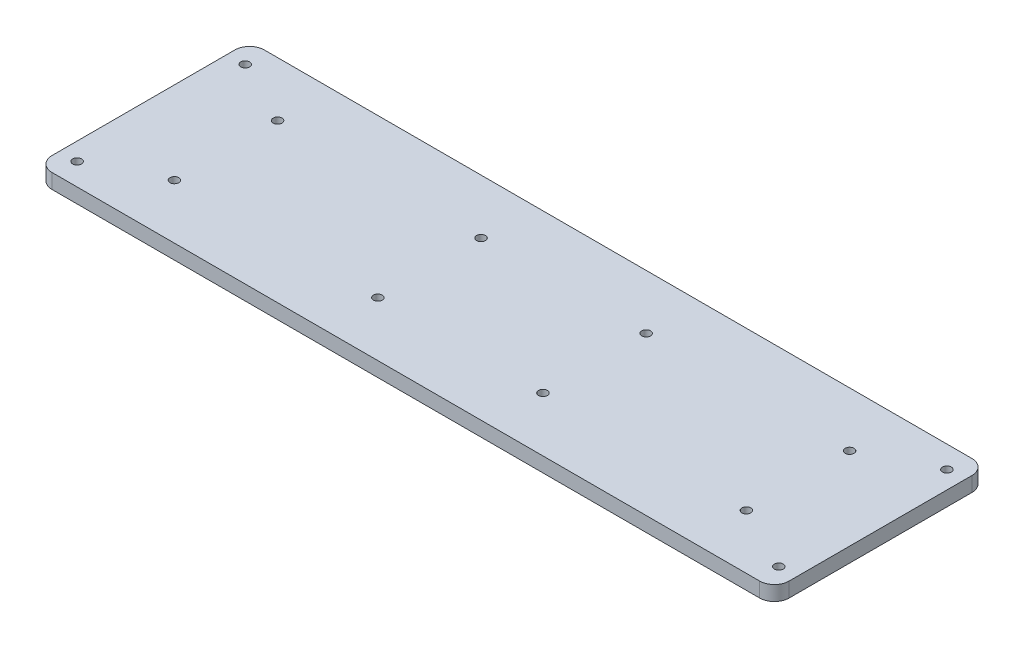
ISO-10303-21;
HEADER;
FILE_DESCRIPTION(('STEP AP214'),'2;1');
FILE_NAME('part.step','',(''),(''),'','','');
FILE_SCHEMA(('AUTOMOTIVE_DESIGN { 1 0 10303 214 1 1 1 1 }'));
ENDSEC;
DATA;
#1=APPLICATION_CONTEXT('core data for automotive mechanical design processes');
#2=APPLICATION_PROTOCOL_DEFINITION('international standard','automotive_design',2000,#1);
#3=PRODUCT_CONTEXT('',#1,'mechanical');
#4=PRODUCT('Part','Part','',(#3));
#5=PRODUCT_RELATED_PRODUCT_CATEGORY('part','',(#4));
#6=PRODUCT_DEFINITION_FORMATION('','',#4);
#7=PRODUCT_DEFINITION_CONTEXT('part definition',#1,'design');
#8=PRODUCT_DEFINITION('design','',#6,#7);
#9=PRODUCT_DEFINITION_SHAPE('','',#8);
#10=(LENGTH_UNIT() NAMED_UNIT(*) SI_UNIT(.MILLI.,.METRE.));
#11=(NAMED_UNIT(*) PLANE_ANGLE_UNIT() SI_UNIT($,.RADIAN.));
#12=(NAMED_UNIT(*) SI_UNIT($,.STERADIAN.) SOLID_ANGLE_UNIT());
#13=UNCERTAINTY_MEASURE_WITH_UNIT(LENGTH_MEASURE(1.E-05),#10,'distance_accuracy_value','');
#14=(GEOMETRIC_REPRESENTATION_CONTEXT(3) GLOBAL_UNCERTAINTY_ASSIGNED_CONTEXT((#13)) GLOBAL_UNIT_ASSIGNED_CONTEXT((#10,
#11,#12)) REPRESENTATION_CONTEXT('',''));
#15=CARTESIAN_POINT('',(0.,0.,0.));
#16=DIRECTION('',(0.,0.,1.));
#17=DIRECTION('',(1.,0.,0.));
#18=AXIS2_PLACEMENT_3D('',#15,#16,#17);
#19=CARTESIAN_POINT('',(0.,5.,0.));
#20=DIRECTION('',(0.,1.,0.));
#21=DIRECTION('',(0.,0.,1.));
#22=AXIS2_PLACEMENT_3D('',#19,#20,#21);
#23=PLANE('',#22);
#24=CARTESIAN_POINT('',(28.,5.,17.5));
#25=DIRECTION('',(0.,1.,0.));
#26=DIRECTION('',(0.,0.,-1.));
#27=AXIS2_PLACEMENT_3D('',#24,#25,#26);
#28=CIRCLE('',#27,1.5);
#29=CARTESIAN_POINT('',(28.,5.,16.));
#30=VERTEX_POINT('',#29);
#31=EDGE_CURVE('E240',#30,#30,#28,.T.);
#32=ORIENTED_EDGE('',*,*,#31,.F.);
#33=EDGE_LOOP('',(#32));
#34=FACE_BOUND('',#33,.T.);
#35=CARTESIAN_POINT('',(97.,5.,-17.5));
#36=DIRECTION('',(0.,1.,0.));
#37=DIRECTION('',(0.,0.,-1.));
#38=AXIS2_PLACEMENT_3D('',#35,#36,#37);
#39=CIRCLE('',#38,1.5);
#40=CARTESIAN_POINT('',(97.,5.,-19.));
#41=VERTEX_POINT('',#40);
#42=EDGE_CURVE('E228',#41,#41,#39,.T.);
#43=ORIENTED_EDGE('',*,*,#42,.F.);
#44=EDGE_LOOP('',(#43));
#45=FACE_BOUND('',#44,.T.);
#46=CARTESIAN_POINT('',(-28.,5.,-17.5));
#47=DIRECTION('',(0.,1.,0.));
#48=DIRECTION('',(0.,0.,-1.));
#49=AXIS2_PLACEMENT_3D('',#46,#47,#48);
#50=CIRCLE('',#49,1.5);
#51=CARTESIAN_POINT('',(-28.,5.,-19.));
#52=VERTEX_POINT('',#51);
#53=EDGE_CURVE('E216',#52,#52,#50,.T.);
#54=ORIENTED_EDGE('',*,*,#53,.F.);
#55=EDGE_LOOP('',(#54));
#56=FACE_BOUND('',#55,.T.);
#57=CARTESIAN_POINT('',(-97.,5.,-17.5));
#58=DIRECTION('',(0.,1.,0.));
#59=DIRECTION('',(0.,0.,1.));
#60=AXIS2_PLACEMENT_3D('',#57,#58,#59);
#61=CIRCLE('',#60,1.5);
#62=CARTESIAN_POINT('',(-97.,5.,-16.));
#63=VERTEX_POINT('',#62);
#64=EDGE_CURVE('E204',#63,#63,#61,.T.);
#65=ORIENTED_EDGE('',*,*,#64,.F.);
#66=EDGE_LOOP('',(#65));
#67=FACE_BOUND('',#66,.T.);
#68=CARTESIAN_POINT('',(119.,5.,-28.5000000000001));
#69=DIRECTION('',(0.,1.,0.));
#70=DIRECTION('',(0.,0.,1.));
#71=AXIS2_PLACEMENT_3D('',#68,#69,#70);
#72=CIRCLE('',#71,1.5);
#73=CARTESIAN_POINT('',(119.,5.,-27.0000000000001));
#74=VERTEX_POINT('',#73);
#75=EDGE_CURVE('E192',#74,#74,#72,.T.);
#76=ORIENTED_EDGE('',*,*,#75,.F.);
#77=EDGE_LOOP('',(#76));
#78=FACE_BOUND('',#77,.T.);
#79=CARTESIAN_POINT('',(-119.,5.,28.5));
#80=DIRECTION('',(0.,1.,0.));
#81=DIRECTION('',(0.,0.,1.));
#82=AXIS2_PLACEMENT_3D('',#79,#80,#81);
#83=CIRCLE('',#82,1.5);
#84=CARTESIAN_POINT('',(-119.,5.,30.));
#85=VERTEX_POINT('',#84);
#86=EDGE_CURVE('E133',#85,#85,#83,.T.);
#87=ORIENTED_EDGE('',*,*,#86,.F.);
#88=EDGE_LOOP('',(#87));
#89=FACE_BOUND('',#88,.T.);
#90=DIRECTION('',(-1.,0.,0.));
#91=VECTOR('',#90,1.);
#92=CARTESIAN_POINT('',(125.,5.,-36.));
#93=LINE('',#92,#91);
#94=CARTESIAN_POINT('',(120.,5.,-36.));
#95=VERTEX_POINT('',#94);
#96=CARTESIAN_POINT('',(-120.,5.,-36.));
#97=VERTEX_POINT('',#96);
#98=EDGE_CURVE('E142',#95,#97,#93,.T.);
#99=ORIENTED_EDGE('',*,*,#98,.T.);
#100=CARTESIAN_POINT('',(-120.,5.,-31.));
#101=DIRECTION('',(0.,1.,0.));
#102=DIRECTION('',(0.,0.,1.));
#103=AXIS2_PLACEMENT_3D('',#100,#101,#102);
#104=CIRCLE('',#103,5.);
#105=CARTESIAN_POINT('',(-125.,5.,-31.));
#106=VERTEX_POINT('',#105);
#107=EDGE_CURVE('E161',#97,#106,#104,.T.);
#108=ORIENTED_EDGE('',*,*,#107,.T.);
#109=DIRECTION('',(0.,0.,1.));
#110=VECTOR('',#109,1.);
#111=CARTESIAN_POINT('',(-125.,5.,36.));
#112=LINE('',#111,#110);
#113=CARTESIAN_POINT('',(-125.,5.,31.));
#114=VERTEX_POINT('',#113);
#115=EDGE_CURVE('E125',#106,#114,#112,.T.);
#116=ORIENTED_EDGE('',*,*,#115,.T.);
#117=CARTESIAN_POINT('',(-120.,5.,31.));
#118=DIRECTION('',(0.,1.,0.));
#119=DIRECTION('',(0.,0.,1.));
#120=AXIS2_PLACEMENT_3D('',#117,#118,#119);
#121=CIRCLE('',#120,5.);
#122=CARTESIAN_POINT('',(-120.,5.,36.));
#123=VERTEX_POINT('',#122);
#124=EDGE_CURVE('E156',#114,#123,#121,.T.);
#125=ORIENTED_EDGE('',*,*,#124,.T.);
#126=DIRECTION('',(1.,0.,0.));
#127=VECTOR('',#126,1.);
#128=CARTESIAN_POINT('',(125.,5.,36.));
#129=LINE('',#128,#127);
#130=CARTESIAN_POINT('',(120.,5.,36.));
#131=VERTEX_POINT('',#130);
#132=EDGE_CURVE('E172',#123,#131,#129,.T.);
#133=ORIENTED_EDGE('',*,*,#132,.T.);
#134=CARTESIAN_POINT('',(120.,5.,31.));
#135=DIRECTION('',(0.,1.,0.));
#136=DIRECTION('',(0.,0.,1.));
#137=AXIS2_PLACEMENT_3D('',#134,#135,#136);
#138=CIRCLE('',#137,5.);
#139=CARTESIAN_POINT('',(125.,5.,31.));
#140=VERTEX_POINT('',#139);
#141=EDGE_CURVE('E61',#131,#140,#138,.T.);
#142=ORIENTED_EDGE('',*,*,#141,.T.);
#143=DIRECTION('',(0.,0.,-1.));
#144=VECTOR('',#143,1.);
#145=CARTESIAN_POINT('',(125.,5.,36.));
#146=LINE('',#145,#144);
#147=CARTESIAN_POINT('',(125.,5.,-31.));
#148=VERTEX_POINT('',#147);
#149=EDGE_CURVE('E180',#140,#148,#146,.T.);
#150=ORIENTED_EDGE('',*,*,#149,.T.);
#151=CARTESIAN_POINT('',(120.,5.,-31.));
#152=DIRECTION('',(0.,1.,0.));
#153=DIRECTION('',(0.,0.,1.));
#154=AXIS2_PLACEMENT_3D('',#151,#152,#153);
#155=CIRCLE('',#154,5.);
#156=EDGE_CURVE('E159',#148,#95,#155,.T.);
#157=ORIENTED_EDGE('',*,*,#156,.T.);
#158=EDGE_LOOP('',(#99,#108,#116,#125,#133,#142,#150,#157));
#159=FACE_BOUND('',#158,.T.);
#160=CARTESIAN_POINT('',(119.,5.,28.5));
#161=DIRECTION('',(0.,1.,0.));
#162=DIRECTION('',(0.,0.,-1.));
#163=AXIS2_PLACEMENT_3D('',#160,#161,#162);
#164=CIRCLE('',#163,1.5);
#165=CARTESIAN_POINT('',(119.,5.,27.));
#166=VERTEX_POINT('',#165);
#167=EDGE_CURVE('E187',#166,#166,#164,.T.);
#168=ORIENTED_EDGE('',*,*,#167,.F.);
#169=EDGE_LOOP('',(#168));
#170=FACE_BOUND('',#169,.T.);
#171=CARTESIAN_POINT('',(-119.,5.,-28.5));
#172=DIRECTION('',(0.,1.,0.));
#173=DIRECTION('',(0.,0.,-1.));
#174=AXIS2_PLACEMENT_3D('',#171,#172,#173);
#175=CIRCLE('',#174,1.5);
#176=CARTESIAN_POINT('',(-119.,5.,-30.));
#177=VERTEX_POINT('',#176);
#178=EDGE_CURVE('E198',#177,#177,#175,.T.);
#179=ORIENTED_EDGE('',*,*,#178,.F.);
#180=EDGE_LOOP('',(#179));
#181=FACE_BOUND('',#180,.T.);
#182=CARTESIAN_POINT('',(-97.,5.,17.5));
#183=DIRECTION('',(0.,1.,0.));
#184=DIRECTION('',(0.,0.,-1.));
#185=AXIS2_PLACEMENT_3D('',#182,#183,#184);
#186=CIRCLE('',#185,1.5);
#187=CARTESIAN_POINT('',(-97.,5.,16.));
#188=VERTEX_POINT('',#187);
#189=EDGE_CURVE('E210',#188,#188,#186,.T.);
#190=ORIENTED_EDGE('',*,*,#189,.F.);
#191=EDGE_LOOP('',(#190));
#192=FACE_BOUND('',#191,.T.);
#193=CARTESIAN_POINT('',(-28.,5.,17.5));
#194=DIRECTION('',(0.,1.,0.));
#195=DIRECTION('',(0.,0.,1.));
#196=AXIS2_PLACEMENT_3D('',#193,#194,#195);
#197=CIRCLE('',#196,1.5);
#198=CARTESIAN_POINT('',(-28.,5.,19.));
#199=VERTEX_POINT('',#198);
#200=EDGE_CURVE('E222',#199,#199,#197,.T.);
#201=ORIENTED_EDGE('',*,*,#200,.F.);
#202=EDGE_LOOP('',(#201));
#203=FACE_BOUND('',#202,.T.);
#204=CARTESIAN_POINT('',(97.,5.,17.5));
#205=DIRECTION('',(0.,1.,0.));
#206=DIRECTION('',(0.,0.,1.));
#207=AXIS2_PLACEMENT_3D('',#204,#205,#206);
#208=CIRCLE('',#207,1.5);
#209=CARTESIAN_POINT('',(97.,5.,19.));
#210=VERTEX_POINT('',#209);
#211=EDGE_CURVE('E234',#210,#210,#208,.T.);
#212=ORIENTED_EDGE('',*,*,#211,.F.);
#213=EDGE_LOOP('',(#212));
#214=FACE_BOUND('',#213,.T.);
#215=CARTESIAN_POINT('',(28.,5.,-17.5));
#216=DIRECTION('',(0.,1.,0.));
#217=DIRECTION('',(0.,0.,1.));
#218=AXIS2_PLACEMENT_3D('',#215,#216,#217);
#219=CIRCLE('',#218,1.5);
#220=CARTESIAN_POINT('',(28.,5.,-16.));
#221=VERTEX_POINT('',#220);
#222=EDGE_CURVE('E246',#221,#221,#219,.T.);
#223=ORIENTED_EDGE('',*,*,#222,.F.);
#224=EDGE_LOOP('',(#223));
#225=FACE_BOUND('',#224,.T.);
#226=ADVANCED_FACE('F39',(#34,#45,#56,#67,#78,#89,#159,#170,#181,#192,#203,#214,#225),#23,.T.);
#227=CARTESIAN_POINT('',(0.,0.,0.));
#228=DIRECTION('',(0.,1.,0.));
#229=DIRECTION('',(0.,0.,1.));
#230=AXIS2_PLACEMENT_3D('',#227,#228,#229);
#231=PLANE('',#230);
#232=DIRECTION('',(0.,0.,1.));
#233=VECTOR('',#232,1.);
#234=CARTESIAN_POINT('',(-125.,0.,36.));
#235=LINE('',#234,#233);
#236=CARTESIAN_POINT('',(-125.,0.,-31.));
#237=VERTEX_POINT('',#236);
#238=CARTESIAN_POINT('',(-125.,0.,31.));
#239=VERTEX_POINT('',#238);
#240=EDGE_CURVE('E122',#237,#239,#235,.T.);
#241=ORIENTED_EDGE('',*,*,#240,.F.);
#242=CARTESIAN_POINT('',(-120.,0.,-31.));
#243=DIRECTION('',(0.,1.,0.));
#244=DIRECTION('',(0.,0.,1.));
#245=AXIS2_PLACEMENT_3D('',#242,#243,#244);
#246=CIRCLE('',#245,5.);
#247=CARTESIAN_POINT('',(-120.,0.,-36.));
#248=VERTEX_POINT('',#247);
#249=EDGE_CURVE('E105',#237,#248,#246,.F.);
#250=ORIENTED_EDGE('',*,*,#249,.T.);
#251=DIRECTION('',(-1.,0.,0.));
#252=VECTOR('',#251,1.);
#253=CARTESIAN_POINT('',(125.,0.,-36.));
#254=LINE('',#253,#252);
#255=CARTESIAN_POINT('',(120.,0.,-36.));
#256=VERTEX_POINT('',#255);
#257=EDGE_CURVE('E146',#256,#248,#254,.T.);
#258=ORIENTED_EDGE('',*,*,#257,.F.);
#259=CARTESIAN_POINT('',(120.,0.,-31.));
#260=DIRECTION('',(0.,1.,0.));
#261=DIRECTION('',(0.,0.,1.));
#262=AXIS2_PLACEMENT_3D('',#259,#260,#261);
#263=CIRCLE('',#262,5.);
#264=CARTESIAN_POINT('',(125.,0.,-31.));
#265=VERTEX_POINT('',#264);
#266=EDGE_CURVE('E116',#256,#265,#263,.F.);
#267=ORIENTED_EDGE('',*,*,#266,.T.);
#268=DIRECTION('',(0.,0.,-1.));
#269=VECTOR('',#268,1.);
#270=CARTESIAN_POINT('',(125.,0.,36.));
#271=LINE('',#270,#269);
#272=CARTESIAN_POINT('',(125.,0.,31.));
#273=VERTEX_POINT('',#272);
#274=EDGE_CURVE('E136',#273,#265,#271,.T.);
#275=ORIENTED_EDGE('',*,*,#274,.F.);
#276=CARTESIAN_POINT('',(120.,0.,31.));
#277=DIRECTION('',(0.,1.,0.));
#278=DIRECTION('',(0.,0.,1.));
#279=AXIS2_PLACEMENT_3D('',#276,#277,#278);
#280=CIRCLE('',#279,5.);
#281=CARTESIAN_POINT('',(120.,0.,36.));
#282=VERTEX_POINT('',#281);
#283=EDGE_CURVE('E150',#273,#282,#280,.F.);
#284=ORIENTED_EDGE('',*,*,#283,.T.);
#285=DIRECTION('',(1.,0.,0.));
#286=VECTOR('',#285,1.);
#287=CARTESIAN_POINT('',(125.,0.,36.));
#288=LINE('',#287,#286);
#289=CARTESIAN_POINT('',(-120.,0.,36.));
#290=VERTEX_POINT('',#289);
#291=EDGE_CURVE('E132',#290,#282,#288,.T.);
#292=ORIENTED_EDGE('',*,*,#291,.F.);
#293=CARTESIAN_POINT('',(-120.,0.,31.));
#294=DIRECTION('',(0.,1.,0.));
#295=DIRECTION('',(0.,0.,1.));
#296=AXIS2_PLACEMENT_3D('',#293,#294,#295);
#297=CIRCLE('',#296,5.);
#298=EDGE_CURVE('E126',#290,#239,#297,.F.);
#299=ORIENTED_EDGE('',*,*,#298,.T.);
#300=EDGE_LOOP('',(#241,#250,#258,#267,#275,#284,#292,#299));
#301=FACE_BOUND('',#300,.T.);
#302=CARTESIAN_POINT('',(-119.,0.,28.5));
#303=DIRECTION('',(0.,1.,0.));
#304=DIRECTION('',(0.,0.,1.));
#305=AXIS2_PLACEMENT_3D('',#302,#303,#304);
#306=CIRCLE('',#305,1.5);
#307=CARTESIAN_POINT('',(-119.,0.,30.));
#308=VERTEX_POINT('',#307);
#309=EDGE_CURVE('E139',#308,#308,#306,.T.);
#310=ORIENTED_EDGE('',*,*,#309,.T.);
#311=EDGE_LOOP('',(#310));
#312=FACE_BOUND('',#311,.T.);
#313=CARTESIAN_POINT('',(119.,0.,28.5));
#314=DIRECTION('',(0.,1.,0.));
#315=DIRECTION('',(0.,0.,-1.));
#316=AXIS2_PLACEMENT_3D('',#313,#314,#315);
#317=CIRCLE('',#316,1.5);
#318=CARTESIAN_POINT('',(119.,0.,27.));
#319=VERTEX_POINT('',#318);
#320=EDGE_CURVE('E189',#319,#319,#317,.T.);
#321=ORIENTED_EDGE('',*,*,#320,.T.);
#322=EDGE_LOOP('',(#321));
#323=FACE_BOUND('',#322,.T.);
#324=CARTESIAN_POINT('',(119.,0.,-28.5000000000001));
#325=DIRECTION('',(0.,1.,0.));
#326=DIRECTION('',(0.,0.,1.));
#327=AXIS2_PLACEMENT_3D('',#324,#325,#326);
#328=CIRCLE('',#327,1.5);
#329=CARTESIAN_POINT('',(119.,0.,-27.0000000000001));
#330=VERTEX_POINT('',#329);
#331=EDGE_CURVE('E195',#330,#330,#328,.T.);
#332=ORIENTED_EDGE('',*,*,#331,.T.);
#333=EDGE_LOOP('',(#332));
#334=FACE_BOUND('',#333,.T.);
#335=CARTESIAN_POINT('',(-119.,0.,-28.5));
#336=DIRECTION('',(0.,1.,0.));
#337=DIRECTION('',(0.,0.,-1.));
#338=AXIS2_PLACEMENT_3D('',#335,#336,#337);
#339=CIRCLE('',#338,1.5);
#340=CARTESIAN_POINT('',(-119.,0.,-30.));
#341=VERTEX_POINT('',#340);
#342=EDGE_CURVE('E201',#341,#341,#339,.T.);
#343=ORIENTED_EDGE('',*,*,#342,.T.);
#344=EDGE_LOOP('',(#343));
#345=FACE_BOUND('',#344,.T.);
#346=CARTESIAN_POINT('',(-97.,0.,-17.5));
#347=DIRECTION('',(0.,1.,0.));
#348=DIRECTION('',(0.,0.,1.));
#349=AXIS2_PLACEMENT_3D('',#346,#347,#348);
#350=CIRCLE('',#349,1.5);
#351=CARTESIAN_POINT('',(-97.,0.,-16.));
#352=VERTEX_POINT('',#351);
#353=EDGE_CURVE('E207',#352,#352,#350,.T.);
#354=ORIENTED_EDGE('',*,*,#353,.T.);
#355=EDGE_LOOP('',(#354));
#356=FACE_BOUND('',#355,.T.);
#357=CARTESIAN_POINT('',(-97.,0.,17.5));
#358=DIRECTION('',(0.,1.,0.));
#359=DIRECTION('',(0.,0.,-1.));
#360=AXIS2_PLACEMENT_3D('',#357,#358,#359);
#361=CIRCLE('',#360,1.5);
#362=CARTESIAN_POINT('',(-97.,0.,16.));
#363=VERTEX_POINT('',#362);
#364=EDGE_CURVE('E213',#363,#363,#361,.T.);
#365=ORIENTED_EDGE('',*,*,#364,.T.);
#366=EDGE_LOOP('',(#365));
#367=FACE_BOUND('',#366,.T.);
#368=CARTESIAN_POINT('',(-28.,0.,-17.5));
#369=DIRECTION('',(0.,1.,0.));
#370=DIRECTION('',(0.,0.,-1.));
#371=AXIS2_PLACEMENT_3D('',#368,#369,#370);
#372=CIRCLE('',#371,1.5);
#373=CARTESIAN_POINT('',(-28.,0.,-19.));
#374=VERTEX_POINT('',#373);
#375=EDGE_CURVE('E219',#374,#374,#372,.T.);
#376=ORIENTED_EDGE('',*,*,#375,.T.);
#377=EDGE_LOOP('',(#376));
#378=FACE_BOUND('',#377,.T.);
#379=CARTESIAN_POINT('',(-28.,0.,17.5));
#380=DIRECTION('',(0.,1.,0.));
#381=DIRECTION('',(0.,0.,1.));
#382=AXIS2_PLACEMENT_3D('',#379,#380,#381);
#383=CIRCLE('',#382,1.5);
#384=CARTESIAN_POINT('',(-28.,0.,19.));
#385=VERTEX_POINT('',#384);
#386=EDGE_CURVE('E225',#385,#385,#383,.T.);
#387=ORIENTED_EDGE('',*,*,#386,.T.);
#388=EDGE_LOOP('',(#387));
#389=FACE_BOUND('',#388,.T.);
#390=CARTESIAN_POINT('',(97.,0.,-17.5));
#391=DIRECTION('',(0.,1.,0.));
#392=DIRECTION('',(0.,0.,-1.));
#393=AXIS2_PLACEMENT_3D('',#390,#391,#392);
#394=CIRCLE('',#393,1.5);
#395=CARTESIAN_POINT('',(97.,0.,-19.));
#396=VERTEX_POINT('',#395);
#397=EDGE_CURVE('E231',#396,#396,#394,.T.);
#398=ORIENTED_EDGE('',*,*,#397,.T.);
#399=EDGE_LOOP('',(#398));
#400=FACE_BOUND('',#399,.T.);
#401=CARTESIAN_POINT('',(97.,0.,17.5));
#402=DIRECTION('',(0.,1.,0.));
#403=DIRECTION('',(0.,0.,1.));
#404=AXIS2_PLACEMENT_3D('',#401,#402,#403);
#405=CIRCLE('',#404,1.5);
#406=CARTESIAN_POINT('',(97.,0.,19.));
#407=VERTEX_POINT('',#406);
#408=EDGE_CURVE('E237',#407,#407,#405,.T.);
#409=ORIENTED_EDGE('',*,*,#408,.T.);
#410=EDGE_LOOP('',(#409));
#411=FACE_BOUND('',#410,.T.);
#412=CARTESIAN_POINT('',(28.,0.,17.5));
#413=DIRECTION('',(0.,1.,0.));
#414=DIRECTION('',(0.,0.,-1.));
#415=AXIS2_PLACEMENT_3D('',#412,#413,#414);
#416=CIRCLE('',#415,1.5);
#417=CARTESIAN_POINT('',(28.,0.,16.));
#418=VERTEX_POINT('',#417);
#419=EDGE_CURVE('E243',#418,#418,#416,.T.);
#420=ORIENTED_EDGE('',*,*,#419,.T.);
#421=EDGE_LOOP('',(#420));
#422=FACE_BOUND('',#421,.T.);
#423=CARTESIAN_POINT('',(28.,0.,-17.5));
#424=DIRECTION('',(0.,1.,0.));
#425=DIRECTION('',(0.,0.,1.));
#426=AXIS2_PLACEMENT_3D('',#423,#424,#425);
#427=CIRCLE('',#426,1.5);
#428=CARTESIAN_POINT('',(28.,0.,-16.));
#429=VERTEX_POINT('',#428);
#430=EDGE_CURVE('E249',#429,#429,#427,.T.);
#431=ORIENTED_EDGE('',*,*,#430,.T.);
#432=EDGE_LOOP('',(#431));
#433=FACE_BOUND('',#432,.T.);
#434=ADVANCED_FACE('F129',(#301,#312,#323,#334,#345,#356,#367,#378,#389,#400,#411,#422,#433),
#231,.F.);
#435=CARTESIAN_POINT('',(-125.,5.,36.));
#436=DIRECTION('',(1.,0.,0.));
#437=DIRECTION('',(0.,0.,-1.));
#438=AXIS2_PLACEMENT_3D('',#435,#436,#437);
#439=PLANE('',#438);
#440=ORIENTED_EDGE('',*,*,#115,.F.);
#441=DIRECTION('',(0.,-1.,0.));
#442=VECTOR('',#441,1.);
#443=CARTESIAN_POINT('',(-125.,5.,-31.));
#444=LINE('',#443,#442);
#445=EDGE_CURVE('E109',#106,#237,#444,.T.);
#446=ORIENTED_EDGE('',*,*,#445,.T.);
#447=ORIENTED_EDGE('',*,*,#240,.T.);
#448=DIRECTION('',(0.,-1.,0.));
#449=VECTOR('',#448,1.);
#450=CARTESIAN_POINT('',(-125.,5.,31.));
#451=LINE('',#450,#449);
#452=EDGE_CURVE('E127',#239,#114,#451,.F.);
#453=ORIENTED_EDGE('',*,*,#452,.T.);
#454=EDGE_LOOP('',(#440,#446,#447,#453));
#455=FACE_BOUND('',#454,.T.);
#456=ADVANCED_FACE('F121',(#455),#439,.F.);
#457=CARTESIAN_POINT('',(125.,5.,36.));
#458=DIRECTION('',(0.,0.,-1.));
#459=DIRECTION('',(-1.,0.,0.));
#460=AXIS2_PLACEMENT_3D('',#457,#458,#459);
#461=PLANE('',#460);
#462=ORIENTED_EDGE('',*,*,#291,.T.);
#463=DIRECTION('',(0.,-1.,0.));
#464=VECTOR('',#463,1.);
#465=CARTESIAN_POINT('',(120.,5.,36.));
#466=LINE('',#465,#464);
#467=EDGE_CURVE('E11',#282,#131,#466,.F.);
#468=ORIENTED_EDGE('',*,*,#467,.T.);
#469=ORIENTED_EDGE('',*,*,#132,.F.);
#470=DIRECTION('',(0.,-1.,0.));
#471=VECTOR('',#470,1.);
#472=CARTESIAN_POINT('',(-120.,5.,36.));
#473=LINE('',#472,#471);
#474=EDGE_CURVE('E47',#123,#290,#473,.T.);
#475=ORIENTED_EDGE('',*,*,#474,.T.);
#476=EDGE_LOOP('',(#462,#468,#469,#475));
#477=FACE_BOUND('',#476,.T.);
#478=ADVANCED_FACE('F170',(#477),#461,.F.);
#479=CARTESIAN_POINT('',(125.,5.,36.));
#480=DIRECTION('',(-1.,0.,0.));
#481=DIRECTION('',(0.,0.,1.));
#482=AXIS2_PLACEMENT_3D('',#479,#480,#481);
#483=PLANE('',#482);
#484=ORIENTED_EDGE('',*,*,#274,.T.);
#485=DIRECTION('',(0.,-1.,0.));
#486=VECTOR('',#485,1.);
#487=CARTESIAN_POINT('',(125.,5.,-31.));
#488=LINE('',#487,#486);
#489=EDGE_CURVE('E54',#265,#148,#488,.F.);
#490=ORIENTED_EDGE('',*,*,#489,.T.);
#491=ORIENTED_EDGE('',*,*,#149,.F.);
#492=DIRECTION('',(0.,-1.,0.));
#493=VECTOR('',#492,1.);
#494=CARTESIAN_POINT('',(125.,5.,31.));
#495=LINE('',#494,#493);
#496=EDGE_CURVE('E163',#140,#273,#495,.T.);
#497=ORIENTED_EDGE('',*,*,#496,.T.);
#498=EDGE_LOOP('',(#484,#490,#491,#497));
#499=FACE_BOUND('',#498,.T.);
#500=ADVANCED_FACE('F179',(#499),#483,.F.);
#501=CARTESIAN_POINT('',(125.,5.,-36.));
#502=DIRECTION('',(0.,0.,1.));
#503=DIRECTION('',(1.,0.,0.));
#504=AXIS2_PLACEMENT_3D('',#501,#502,#503);
#505=PLANE('',#504);
#506=ORIENTED_EDGE('',*,*,#257,.T.);
#507=DIRECTION('',(0.,-1.,0.));
#508=VECTOR('',#507,1.);
#509=CARTESIAN_POINT('',(-120.,5.,-36.));
#510=LINE('',#509,#508);
#511=EDGE_CURVE('E110',#248,#97,#510,.F.);
#512=ORIENTED_EDGE('',*,*,#511,.T.);
#513=ORIENTED_EDGE('',*,*,#98,.F.);
#514=DIRECTION('',(0.,-1.,0.));
#515=VECTOR('',#514,1.);
#516=CARTESIAN_POINT('',(120.,5.,-36.));
#517=LINE('',#516,#515);
#518=EDGE_CURVE('E115',#95,#256,#517,.T.);
#519=ORIENTED_EDGE('',*,*,#518,.T.);
#520=EDGE_LOOP('',(#506,#512,#513,#519));
#521=FACE_BOUND('',#520,.T.);
#522=ADVANCED_FACE('F272',(#521),#505,.F.);
#523=CARTESIAN_POINT('',(-119.,5.,28.5));
#524=DIRECTION('',(0.,-1.,0.));
#525=DIRECTION('',(0.,0.,-1.));
#526=AXIS2_PLACEMENT_3D('',#523,#524,#525);
#527=CYLINDRICAL_SURFACE('',#526,1.5);
#528=ORIENTED_EDGE('',*,*,#86,.T.);
#529=EDGE_LOOP('',(#528));
#530=FACE_BOUND('',#529,.T.);
#531=ORIENTED_EDGE('',*,*,#309,.F.);
#532=EDGE_LOOP('',(#531));
#533=FACE_BOUND('',#532,.T.);
#534=ADVANCED_FACE('F269',(#530,#533),#527,.F.);
#535=CARTESIAN_POINT('',(119.,5.,28.5));
#536=DIRECTION('',(0.,-1.,0.));
#537=DIRECTION('',(0.,0.,-1.));
#538=AXIS2_PLACEMENT_3D('',#535,#536,#537);
#539=CYLINDRICAL_SURFACE('',#538,1.5);
#540=ORIENTED_EDGE('',*,*,#167,.T.);
#541=EDGE_LOOP('',(#540));
#542=FACE_BOUND('',#541,.T.);
#543=ORIENTED_EDGE('',*,*,#320,.F.);
#544=EDGE_LOOP('',(#543));
#545=FACE_BOUND('',#544,.T.);
#546=ADVANCED_FACE('F350',(#542,#545),#539,.F.);
#547=CARTESIAN_POINT('',(119.,5.,-28.5000000000001));
#548=DIRECTION('',(0.,-1.,0.));
#549=DIRECTION('',(0.,0.,-1.));
#550=AXIS2_PLACEMENT_3D('',#547,#548,#549);
#551=CYLINDRICAL_SURFACE('',#550,1.5);
#552=ORIENTED_EDGE('',*,*,#75,.T.);
#553=EDGE_LOOP('',(#552));
#554=FACE_BOUND('',#553,.T.);
#555=ORIENTED_EDGE('',*,*,#331,.F.);
#556=EDGE_LOOP('',(#555));
#557=FACE_BOUND('',#556,.T.);
#558=ADVANCED_FACE('F347',(#554,#557),#551,.F.);
#559=CARTESIAN_POINT('',(-119.,5.,-28.5));
#560=DIRECTION('',(0.,-1.,0.));
#561=DIRECTION('',(0.,0.,-1.));
#562=AXIS2_PLACEMENT_3D('',#559,#560,#561);
#563=CYLINDRICAL_SURFACE('',#562,1.5);
#564=ORIENTED_EDGE('',*,*,#178,.T.);
#565=EDGE_LOOP('',(#564));
#566=FACE_BOUND('',#565,.T.);
#567=ORIENTED_EDGE('',*,*,#342,.F.);
#568=EDGE_LOOP('',(#567));
#569=FACE_BOUND('',#568,.T.);
#570=ADVANCED_FACE('F343',(#566,#569),#563,.F.);
#571=CARTESIAN_POINT('',(-97.,5.,-17.5));
#572=DIRECTION('',(0.,-1.,0.));
#573=DIRECTION('',(0.,0.,-1.));
#574=AXIS2_PLACEMENT_3D('',#571,#572,#573);
#575=CYLINDRICAL_SURFACE('',#574,1.5);
#576=ORIENTED_EDGE('',*,*,#64,.T.);
#577=EDGE_LOOP('',(#576));
#578=FACE_BOUND('',#577,.T.);
#579=ORIENTED_EDGE('',*,*,#353,.F.);
#580=EDGE_LOOP('',(#579));
#581=FACE_BOUND('',#580,.T.);
#582=ADVANCED_FACE('F339',(#578,#581),#575,.F.);
#583=CARTESIAN_POINT('',(-97.,5.,17.5));
#584=DIRECTION('',(0.,-1.,0.));
#585=DIRECTION('',(0.,0.,-1.));
#586=AXIS2_PLACEMENT_3D('',#583,#584,#585);
#587=CYLINDRICAL_SURFACE('',#586,1.5);
#588=ORIENTED_EDGE('',*,*,#189,.T.);
#589=EDGE_LOOP('',(#588));
#590=FACE_BOUND('',#589,.T.);
#591=ORIENTED_EDGE('',*,*,#364,.F.);
#592=EDGE_LOOP('',(#591));
#593=FACE_BOUND('',#592,.T.);
#594=ADVANCED_FACE('F335',(#590,#593),#587,.F.);
#595=CARTESIAN_POINT('',(-28.,5.,-17.5));
#596=DIRECTION('',(0.,-1.,0.));
#597=DIRECTION('',(0.,0.,-1.));
#598=AXIS2_PLACEMENT_3D('',#595,#596,#597);
#599=CYLINDRICAL_SURFACE('',#598,1.5);
#600=ORIENTED_EDGE('',*,*,#53,.T.);
#601=EDGE_LOOP('',(#600));
#602=FACE_BOUND('',#601,.T.);
#603=ORIENTED_EDGE('',*,*,#375,.F.);
#604=EDGE_LOOP('',(#603));
#605=FACE_BOUND('',#604,.T.);
#606=ADVANCED_FACE('F331',(#602,#605),#599,.F.);
#607=CARTESIAN_POINT('',(-28.,5.,17.5));
#608=DIRECTION('',(0.,-1.,0.));
#609=DIRECTION('',(0.,0.,-1.));
#610=AXIS2_PLACEMENT_3D('',#607,#608,#609);
#611=CYLINDRICAL_SURFACE('',#610,1.5);
#612=ORIENTED_EDGE('',*,*,#200,.T.);
#613=EDGE_LOOP('',(#612));
#614=FACE_BOUND('',#613,.T.);
#615=ORIENTED_EDGE('',*,*,#386,.F.);
#616=EDGE_LOOP('',(#615));
#617=FACE_BOUND('',#616,.T.);
#618=ADVANCED_FACE('F327',(#614,#617),#611,.F.);
#619=CARTESIAN_POINT('',(97.,5.,-17.5));
#620=DIRECTION('',(0.,-1.,0.));
#621=DIRECTION('',(0.,0.,-1.));
#622=AXIS2_PLACEMENT_3D('',#619,#620,#621);
#623=CYLINDRICAL_SURFACE('',#622,1.5);
#624=ORIENTED_EDGE('',*,*,#42,.T.);
#625=EDGE_LOOP('',(#624));
#626=FACE_BOUND('',#625,.T.);
#627=ORIENTED_EDGE('',*,*,#397,.F.);
#628=EDGE_LOOP('',(#627));
#629=FACE_BOUND('',#628,.T.);
#630=ADVANCED_FACE('F310',(#626,#629),#623,.F.);
#631=CARTESIAN_POINT('',(97.,5.,17.5));
#632=DIRECTION('',(0.,-1.,0.));
#633=DIRECTION('',(0.,0.,-1.));
#634=AXIS2_PLACEMENT_3D('',#631,#632,#633);
#635=CYLINDRICAL_SURFACE('',#634,1.5);
#636=ORIENTED_EDGE('',*,*,#211,.T.);
#637=EDGE_LOOP('',(#636));
#638=FACE_BOUND('',#637,.T.);
#639=ORIENTED_EDGE('',*,*,#408,.F.);
#640=EDGE_LOOP('',(#639));
#641=FACE_BOUND('',#640,.T.);
#642=ADVANCED_FACE('F306',(#638,#641),#635,.F.);
#643=CARTESIAN_POINT('',(28.,5.,17.5));
#644=DIRECTION('',(0.,-1.,0.));
#645=DIRECTION('',(0.,0.,-1.));
#646=AXIS2_PLACEMENT_3D('',#643,#644,#645);
#647=CYLINDRICAL_SURFACE('',#646,1.5);
#648=ORIENTED_EDGE('',*,*,#31,.T.);
#649=EDGE_LOOP('',(#648));
#650=FACE_BOUND('',#649,.T.);
#651=ORIENTED_EDGE('',*,*,#419,.F.);
#652=EDGE_LOOP('',(#651));
#653=FACE_BOUND('',#652,.T.);
#654=ADVANCED_FACE('F309',(#650,#653),#647,.F.);
#655=CARTESIAN_POINT('',(28.,5.,-17.5));
#656=DIRECTION('',(0.,-1.,0.));
#657=DIRECTION('',(0.,0.,-1.));
#658=AXIS2_PLACEMENT_3D('',#655,#656,#657);
#659=CYLINDRICAL_SURFACE('',#658,1.5);
#660=ORIENTED_EDGE('',*,*,#222,.T.);
#661=EDGE_LOOP('',(#660));
#662=FACE_BOUND('',#661,.T.);
#663=ORIENTED_EDGE('',*,*,#430,.F.);
#664=EDGE_LOOP('',(#663));
#665=FACE_BOUND('',#664,.T.);
#666=ADVANCED_FACE('F255',(#662,#665),#659,.F.);
#667=CARTESIAN_POINT('',(-120.,5.,-31.));
#668=DIRECTION('',(0.,-1.,0.));
#669=DIRECTION('',(0.,0.,-1.));
#670=AXIS2_PLACEMENT_3D('',#667,#668,#669);
#671=CYLINDRICAL_SURFACE('',#670,5.);
#672=ORIENTED_EDGE('',*,*,#107,.F.);
#673=ORIENTED_EDGE('',*,*,#511,.F.);
#674=ORIENTED_EDGE('',*,*,#249,.F.);
#675=ORIENTED_EDGE('',*,*,#445,.F.);
#676=EDGE_LOOP('',(#672,#673,#674,#675));
#677=FACE_BOUND('',#676,.T.);
#678=ADVANCED_FACE('F108',(#677),#671,.T.);
#679=CARTESIAN_POINT('',(120.,5.,-31.));
#680=DIRECTION('',(0.,-1.,0.));
#681=DIRECTION('',(0.,0.,-1.));
#682=AXIS2_PLACEMENT_3D('',#679,#680,#681);
#683=CYLINDRICAL_SURFACE('',#682,5.);
#684=ORIENTED_EDGE('',*,*,#156,.F.);
#685=ORIENTED_EDGE('',*,*,#489,.F.);
#686=ORIENTED_EDGE('',*,*,#266,.F.);
#687=ORIENTED_EDGE('',*,*,#518,.F.);
#688=EDGE_LOOP('',(#684,#685,#686,#687));
#689=FACE_BOUND('',#688,.T.);
#690=ADVANCED_FACE('F284',(#689),#683,.T.);
#691=CARTESIAN_POINT('',(120.,5.,31.));
#692=DIRECTION('',(0.,-1.,0.));
#693=DIRECTION('',(0.,0.,-1.));
#694=AXIS2_PLACEMENT_3D('',#691,#692,#693);
#695=CYLINDRICAL_SURFACE('',#694,5.);
#696=ORIENTED_EDGE('',*,*,#141,.F.);
#697=ORIENTED_EDGE('',*,*,#467,.F.);
#698=ORIENTED_EDGE('',*,*,#283,.F.);
#699=ORIENTED_EDGE('',*,*,#496,.F.);
#700=EDGE_LOOP('',(#696,#697,#698,#699));
#701=FACE_BOUND('',#700,.T.);
#702=ADVANCED_FACE('F178',(#701),#695,.T.);
#703=CARTESIAN_POINT('',(-120.,5.,31.));
#704=DIRECTION('',(0.,-1.,0.));
#705=DIRECTION('',(0.,0.,-1.));
#706=AXIS2_PLACEMENT_3D('',#703,#704,#705);
#707=CYLINDRICAL_SURFACE('',#706,5.);
#708=ORIENTED_EDGE('',*,*,#124,.F.);
#709=ORIENTED_EDGE('',*,*,#452,.F.);
#710=ORIENTED_EDGE('',*,*,#298,.F.);
#711=ORIENTED_EDGE('',*,*,#474,.F.);
#712=EDGE_LOOP('',(#708,#709,#710,#711));
#713=FACE_BOUND('',#712,.T.);
#714=ADVANCED_FACE('F41',(#713),#707,.T.);
#715=CLOSED_SHELL('',(#226,#434,#456,#478,#500,#522,#534,#546,#558,#570,#582,#594,#606,#618,
#630,#642,#654,#666,#678,#690,#702,#714));
#716=MANIFOLD_SOLID_BREP('B2',#715);
#717=ADVANCED_BREP_SHAPE_REPRESENTATION('',(#18,#716),#14);
#718=SHAPE_DEFINITION_REPRESENTATION(#9,#717);
ENDSEC;
END-ISO-10303-21;
